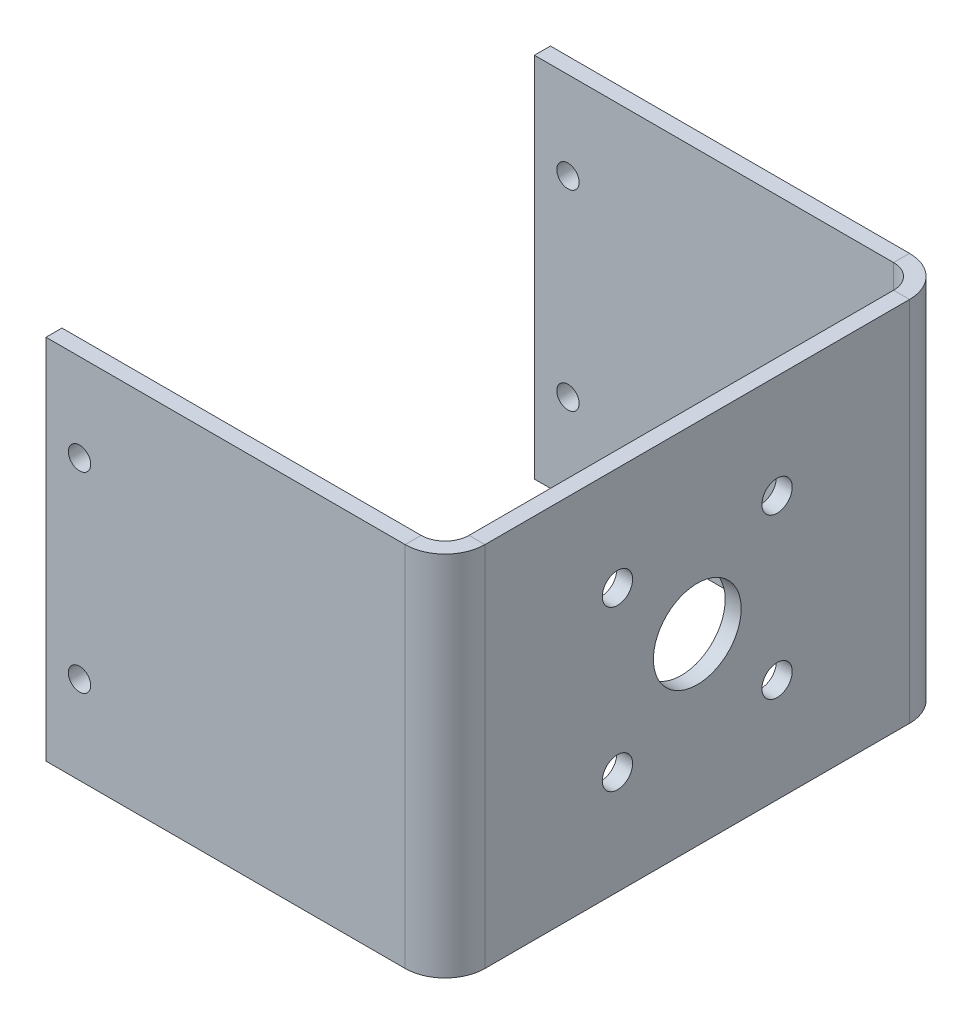
ISO-10303-21;
HEADER;
FILE_DESCRIPTION(('STEP AP214'),'2;1');
FILE_NAME('part.step','',(''),(''),'','','');
FILE_SCHEMA(('AUTOMOTIVE_DESIGN { 1 0 10303 214 1 1 1 1 }'));
ENDSEC;
DATA;
#1=APPLICATION_CONTEXT('core data for automotive mechanical design processes');
#2=APPLICATION_PROTOCOL_DEFINITION('international standard','automotive_design',2000,#1);
#3=PRODUCT_CONTEXT('',#1,'mechanical');
#4=PRODUCT('Part','Part','',(#3));
#5=PRODUCT_RELATED_PRODUCT_CATEGORY('part','',(#4));
#6=PRODUCT_DEFINITION_FORMATION('','',#4);
#7=PRODUCT_DEFINITION_CONTEXT('part definition',#1,'design');
#8=PRODUCT_DEFINITION('design','',#6,#7);
#9=PRODUCT_DEFINITION_SHAPE('','',#8);
#10=(LENGTH_UNIT() NAMED_UNIT(*) SI_UNIT(.MILLI.,.METRE.));
#11=(NAMED_UNIT(*) PLANE_ANGLE_UNIT() SI_UNIT($,.RADIAN.));
#12=(NAMED_UNIT(*) SI_UNIT($,.STERADIAN.) SOLID_ANGLE_UNIT());
#13=UNCERTAINTY_MEASURE_WITH_UNIT(LENGTH_MEASURE(1.E-05),#10,'distance_accuracy_value','');
#14=(GEOMETRIC_REPRESENTATION_CONTEXT(3) GLOBAL_UNCERTAINTY_ASSIGNED_CONTEXT((#13)) GLOBAL_UNIT_ASSIGNED_CONTEXT((#10,
#11,#12)) REPRESENTATION_CONTEXT('',''));
#15=CARTESIAN_POINT('',(0.,0.,0.));
#16=DIRECTION('',(0.,0.,1.));
#17=DIRECTION('',(1.,0.,0.));
#18=AXIS2_PLACEMENT_3D('',#15,#16,#17);
#19=CARTESIAN_POINT('',(-9.99999999999999,0.,0.));
#20=DIRECTION('',(-1.,0.,0.));
#21=DIRECTION('',(0.,0.,1.));
#22=AXIS2_PLACEMENT_3D('',#19,#20,#21);
#23=PLANE('',#22);
#24=CARTESIAN_POINT('',(-9.99999999999999,49.9999999999998,-50.0000000000002));
#25=DIRECTION('',(1.,0.,0.));
#26=DIRECTION('',(0.,-1.,0.));
#27=AXIS2_PLACEMENT_3D('',#24,#25,#26);
#28=CIRCLE('',#27,9.5);
#29=CARTESIAN_POINT('',(-9.99999999999999,40.4999999999998,-50.0000000000001));
#30=VERTEX_POINT('',#29);
#31=EDGE_CURVE('E374',#30,#30,#28,.T.);
#32=ORIENTED_EDGE('',*,*,#31,.T.);
#33=EDGE_LOOP('',(#32));
#34=FACE_BOUND('',#33,.T.);
#35=CARTESIAN_POINT('',(-9.99999999999999,-50.,-50.));
#36=DIRECTION('',(1.,0.,0.));
#37=DIRECTION('',(0.,0.,1.));
#38=AXIS2_PLACEMENT_3D('',#35,#36,#37);
#39=CIRCLE('',#38,9.5);
#40=CARTESIAN_POINT('',(-9.99999999999999,-50.,-40.5));
#41=VERTEX_POINT('',#40);
#42=EDGE_CURVE('E383',#41,#41,#39,.T.);
#43=ORIENTED_EDGE('',*,*,#42,.T.);
#44=EDGE_LOOP('',(#43));
#45=FACE_BOUND('',#44,.T.);
#46=CARTESIAN_POINT('',(-9.99999999999999,-49.9999999999995,50.0000000000005));
#47=DIRECTION('',(1.,0.,0.));
#48=DIRECTION('',(0.,1.,0.));
#49=AXIS2_PLACEMENT_3D('',#46,#47,#48);
#50=CIRCLE('',#49,9.5);
#51=CARTESIAN_POINT('',(-9.99999999999999,-40.4999999999995,50.0000000000004));
#52=VERTEX_POINT('',#51);
#53=EDGE_CURVE('E391',#52,#52,#50,.T.);
#54=ORIENTED_EDGE('',*,*,#53,.T.);
#55=EDGE_LOOP('',(#54));
#56=FACE_BOUND('',#55,.T.);
#57=CARTESIAN_POINT('',(-9.99999999999999,50.,50.));
#58=DIRECTION('',(1.,0.,0.));
#59=DIRECTION('',(0.,0.,-1.));
#60=AXIS2_PLACEMENT_3D('',#57,#58,#59);
#61=CIRCLE('',#60,9.5);
#62=CARTESIAN_POINT('',(-9.99999999999999,50.,40.5));
#63=VERTEX_POINT('',#62);
#64=EDGE_CURVE('E398',#63,#63,#61,.T.);
#65=ORIENTED_EDGE('',*,*,#64,.T.);
#66=EDGE_LOOP('',(#65));
#67=FACE_BOUND('',#66,.T.);
#68=CARTESIAN_POINT('',(-9.99999999999999,0.,0.));
#69=DIRECTION('',(1.,0.,0.));
#70=DIRECTION('',(0.,0.,-1.));
#71=AXIS2_PLACEMENT_3D('',#68,#69,#70);
#72=CIRCLE('',#71,27.5);
#73=CARTESIAN_POINT('',(-9.99999999999999,0.,-27.5));
#74=VERTEX_POINT('',#73);
#75=EDGE_CURVE('E229',#74,#74,#72,.T.);
#76=ORIENTED_EDGE('',*,*,#75,.T.);
#77=EDGE_LOOP('',(#76));
#78=FACE_BOUND('',#77,.T.);
#79=DIRECTION('',(0.,0.,1.));
#80=VECTOR('',#79,1.);
#81=CARTESIAN_POINT('',(-9.99999999999999,115.,158.));
#82=LINE('',#81,#80);
#83=CARTESIAN_POINT('',(-9.99999999999995,115.,-133.));
#84=VERTEX_POINT('',#83);
#85=CARTESIAN_POINT('',(-9.99999999999999,115.,133.));
#86=VERTEX_POINT('',#85);
#87=EDGE_CURVE('E93',#84,#86,#82,.T.);
#88=ORIENTED_EDGE('',*,*,#87,.F.);
#89=DIRECTION('',(0.,-1.,0.));
#90=VECTOR('',#89,1.);
#91=CARTESIAN_POINT('',(-9.99999999999995,-115.,-133.));
#92=LINE('',#91,#90);
#93=CARTESIAN_POINT('',(-9.99999999999995,-115.,-133.));
#94=VERTEX_POINT('',#93);
#95=EDGE_CURVE('E246',#94,#84,#92,.F.);
#96=ORIENTED_EDGE('',*,*,#95,.F.);
#97=DIRECTION('',(0.,0.,-1.));
#98=VECTOR('',#97,1.);
#99=CARTESIAN_POINT('',(-9.99999999999999,-115.,158.));
#100=LINE('',#99,#98);
#101=CARTESIAN_POINT('',(-9.99999999999999,-115.,133.));
#102=VERTEX_POINT('',#101);
#103=EDGE_CURVE('E13',#102,#94,#100,.T.);
#104=ORIENTED_EDGE('',*,*,#103,.F.);
#105=DIRECTION('',(0.,1.,0.));
#106=VECTOR('',#105,1.);
#107=CARTESIAN_POINT('',(-9.99999999999995,115.,133.));
#108=LINE('',#107,#106);
#109=EDGE_CURVE('E320',#86,#102,#108,.F.);
#110=ORIENTED_EDGE('',*,*,#109,.F.);
#111=EDGE_LOOP('',(#88,#96,#104,#110));
#112=FACE_BOUND('',#111,.T.);
#113=ADVANCED_FACE('F83',(#34,#45,#56,#67,#78,#112),#23,.T.);
#114=CARTESIAN_POINT('',(0.,0.,0.));
#115=DIRECTION('',(-1.,0.,0.));
#116=DIRECTION('',(0.,0.,1.));
#117=AXIS2_PLACEMENT_3D('',#114,#115,#116);
#118=PLANE('',#117);
#119=CARTESIAN_POINT('',(0.,49.9999999999998,-50.0000000000002));
#120=DIRECTION('',(1.,0.,0.));
#121=DIRECTION('',(0.,-1.,0.));
#122=AXIS2_PLACEMENT_3D('',#119,#120,#121);
#123=CIRCLE('',#122,9.5);
#124=CARTESIAN_POINT('',(0.,40.4999999999998,-50.0000000000001));
#125=VERTEX_POINT('',#124);
#126=EDGE_CURVE('E379',#125,#125,#123,.T.);
#127=ORIENTED_EDGE('',*,*,#126,.F.);
#128=EDGE_LOOP('',(#127));
#129=FACE_BOUND('',#128,.T.);
#130=CARTESIAN_POINT('',(0.,-50.,-50.));
#131=DIRECTION('',(1.,0.,0.));
#132=DIRECTION('',(0.,0.,1.));
#133=AXIS2_PLACEMENT_3D('',#130,#131,#132);
#134=CIRCLE('',#133,9.5);
#135=CARTESIAN_POINT('',(0.,-50.,-40.5));
#136=VERTEX_POINT('',#135);
#137=EDGE_CURVE('E387',#136,#136,#134,.T.);
#138=ORIENTED_EDGE('',*,*,#137,.F.);
#139=EDGE_LOOP('',(#138));
#140=FACE_BOUND('',#139,.T.);
#141=CARTESIAN_POINT('',(0.,-49.9999999999995,50.0000000000005));
#142=DIRECTION('',(1.,0.,0.));
#143=DIRECTION('',(0.,1.,0.));
#144=AXIS2_PLACEMENT_3D('',#141,#142,#143);
#145=CIRCLE('',#144,9.5);
#146=CARTESIAN_POINT('',(0.,-40.4999999999995,50.0000000000004));
#147=VERTEX_POINT('',#146);
#148=EDGE_CURVE('E373',#147,#147,#145,.T.);
#149=ORIENTED_EDGE('',*,*,#148,.F.);
#150=EDGE_LOOP('',(#149));
#151=FACE_BOUND('',#150,.T.);
#152=CARTESIAN_POINT('',(0.,50.,50.));
#153=DIRECTION('',(1.,0.,0.));
#154=DIRECTION('',(0.,0.,-1.));
#155=AXIS2_PLACEMENT_3D('',#152,#153,#154);
#156=CIRCLE('',#155,9.5);
#157=CARTESIAN_POINT('',(0.,50.,40.5));
#158=VERTEX_POINT('',#157);
#159=EDGE_CURVE('E378',#158,#158,#156,.T.);
#160=ORIENTED_EDGE('',*,*,#159,.F.);
#161=EDGE_LOOP('',(#160));
#162=FACE_BOUND('',#161,.T.);
#163=CARTESIAN_POINT('',(0.,0.,0.));
#164=DIRECTION('',(1.,0.,0.));
#165=DIRECTION('',(0.,0.,-1.));
#166=AXIS2_PLACEMENT_3D('',#163,#164,#165);
#167=CIRCLE('',#166,27.5);
#168=CARTESIAN_POINT('',(0.,0.,-27.5));
#169=VERTEX_POINT('',#168);
#170=EDGE_CURVE('E402',#169,#169,#167,.T.);
#171=ORIENTED_EDGE('',*,*,#170,.F.);
#172=EDGE_LOOP('',(#171));
#173=FACE_BOUND('',#172,.T.);
#174=DIRECTION('',(0.,-1.,0.));
#175=VECTOR('',#174,1.);
#176=CARTESIAN_POINT('',(0.,-115.,-133.));
#177=LINE('',#176,#175);
#178=CARTESIAN_POINT('',(0.,-115.,-133.));
#179=VERTEX_POINT('',#178);
#180=CARTESIAN_POINT('',(0.,115.,-133.));
#181=VERTEX_POINT('',#180);
#182=EDGE_CURVE('E230',#179,#181,#177,.F.);
#183=ORIENTED_EDGE('',*,*,#182,.T.);
#184=DIRECTION('',(0.,0.,1.));
#185=VECTOR('',#184,1.);
#186=CARTESIAN_POINT('',(0.,115.,158.));
#187=LINE('',#186,#185);
#188=CARTESIAN_POINT('',(0.,115.,133.));
#189=VERTEX_POINT('',#188);
#190=EDGE_CURVE('E329',#181,#189,#187,.T.);
#191=ORIENTED_EDGE('',*,*,#190,.T.);
#192=DIRECTION('',(0.,1.,0.));
#193=VECTOR('',#192,1.);
#194=CARTESIAN_POINT('',(0.,115.,133.));
#195=LINE('',#194,#193);
#196=CARTESIAN_POINT('',(0.,-115.,133.));
#197=VERTEX_POINT('',#196);
#198=EDGE_CURVE('E304',#189,#197,#195,.F.);
#199=ORIENTED_EDGE('',*,*,#198,.T.);
#200=DIRECTION('',(0.,0.,-1.));
#201=VECTOR('',#200,1.);
#202=CARTESIAN_POINT('',(0.,-115.,158.));
#203=LINE('',#202,#201);
#204=EDGE_CURVE('E333',#197,#179,#203,.T.);
#205=ORIENTED_EDGE('',*,*,#204,.T.);
#206=EDGE_LOOP('',(#183,#191,#199,#205));
#207=FACE_BOUND('',#206,.T.);
#208=ADVANCED_FACE('F434',(#129,#140,#151,#162,#173,#207),#118,.F.);
#209=CARTESIAN_POINT('',(-9.99999999999999,-115.,158.));
#210=DIRECTION('',(0.,-1.,0.));
#211=DIRECTION('',(0.,0.,-1.));
#212=AXIS2_PLACEMENT_3D('',#209,#210,#211);
#213=PLANE('',#212);
#214=ORIENTED_EDGE('',*,*,#103,.T.);
#215=DIRECTION('',(1.,0.,0.));
#216=VECTOR('',#215,1.);
#217=CARTESIAN_POINT('',(-9.99999999999995,-115.,-133.));
#218=LINE('',#217,#216);
#219=EDGE_CURVE('E238',#94,#179,#218,.T.);
#220=ORIENTED_EDGE('',*,*,#219,.T.);
#221=ORIENTED_EDGE('',*,*,#204,.F.);
#222=DIRECTION('',(1.,0.,0.));
#223=VECTOR('',#222,1.);
#224=CARTESIAN_POINT('',(-9.99999999999995,-115.,133.));
#225=LINE('',#224,#223);
#226=EDGE_CURVE('E107',#102,#197,#225,.T.);
#227=ORIENTED_EDGE('',*,*,#226,.F.);
#228=EDGE_LOOP('',(#214,#220,#221,#227));
#229=FACE_BOUND('',#228,.T.);
#230=ADVANCED_FACE('F428',(#229),#213,.T.);
#231=CARTESIAN_POINT('',(-9.99999999999999,115.,158.));
#232=DIRECTION('',(0.,1.,0.));
#233=DIRECTION('',(0.,0.,1.));
#234=AXIS2_PLACEMENT_3D('',#231,#232,#233);
#235=PLANE('',#234);
#236=DIRECTION('',(1.,0.,0.));
#237=VECTOR('',#236,1.);
#238=CARTESIAN_POINT('',(-9.99999999999995,115.,-133.));
#239=LINE('',#238,#237);
#240=EDGE_CURVE('E254',#84,#181,#239,.T.);
#241=ORIENTED_EDGE('',*,*,#240,.F.);
#242=ORIENTED_EDGE('',*,*,#87,.T.);
#243=DIRECTION('',(1.,0.,0.));
#244=VECTOR('',#243,1.);
#245=CARTESIAN_POINT('',(-9.99999999999995,115.,133.));
#246=LINE('',#245,#244);
#247=EDGE_CURVE('E312',#86,#189,#246,.T.);
#248=ORIENTED_EDGE('',*,*,#247,.T.);
#249=ORIENTED_EDGE('',*,*,#190,.F.);
#250=EDGE_LOOP('',(#241,#242,#248,#249));
#251=FACE_BOUND('',#250,.T.);
#252=ADVANCED_FACE('F85',(#251),#235,.T.);
#253=CARTESIAN_POINT('',(-25.,-115.,133.));
#254=DIRECTION('',(0.,-1.,0.));
#255=DIRECTION('',(0.,0.,-1.));
#256=AXIS2_PLACEMENT_3D('',#253,#254,#255);
#257=PLANE('',#256);
#258=DIRECTION('',(0.,0.,-1.));
#259=VECTOR('',#258,1.);
#260=CARTESIAN_POINT('',(-25.,-115.,158.));
#261=LINE('',#260,#259);
#262=CARTESIAN_POINT('',(-24.9999999999999,-115.,148.));
#263=VERTEX_POINT('',#262);
#264=CARTESIAN_POINT('',(-24.9999999999999,-115.,158.));
#265=VERTEX_POINT('',#264);
#266=EDGE_CURVE('E258',#263,#265,#261,.F.);
#267=ORIENTED_EDGE('',*,*,#266,.F.);
#268=CARTESIAN_POINT('',(-25.,-115.,133.));
#269=DIRECTION('',(0.,1.,0.));
#270=DIRECTION('',(0.,0.,1.));
#271=AXIS2_PLACEMENT_3D('',#268,#269,#270);
#272=CIRCLE('',#271,15.);
#273=EDGE_CURVE('E316',#102,#263,#272,.F.);
#274=ORIENTED_EDGE('',*,*,#273,.F.);
#275=ORIENTED_EDGE('',*,*,#226,.T.);
#276=CARTESIAN_POINT('',(-25.,-115.,133.));
#277=DIRECTION('',(0.,1.,0.));
#278=DIRECTION('',(0.,0.,1.));
#279=AXIS2_PLACEMENT_3D('',#276,#277,#278);
#280=CIRCLE('',#279,25.);
#281=EDGE_CURVE('E307',#197,#265,#280,.F.);
#282=ORIENTED_EDGE('',*,*,#281,.T.);
#283=EDGE_LOOP('',(#267,#274,#275,#282));
#284=FACE_BOUND('',#283,.T.);
#285=ADVANCED_FACE('F467',(#284),#257,.T.);
#286=CARTESIAN_POINT('',(-25.,115.,133.));
#287=DIRECTION('',(0.,-1.,0.));
#288=DIRECTION('',(0.,0.,-1.));
#289=AXIS2_PLACEMENT_3D('',#286,#287,#288);
#290=PLANE('',#289);
#291=CARTESIAN_POINT('',(-25.,115.,133.));
#292=DIRECTION('',(0.,1.,0.));
#293=DIRECTION('',(0.,0.,1.));
#294=AXIS2_PLACEMENT_3D('',#291,#292,#293);
#295=CIRCLE('',#294,15.);
#296=CARTESIAN_POINT('',(-24.9999999999999,115.,148.));
#297=VERTEX_POINT('',#296);
#298=EDGE_CURVE('E266',#297,#86,#295,.T.);
#299=ORIENTED_EDGE('',*,*,#298,.F.);
#300=DIRECTION('',(0.,0.,-1.));
#301=VECTOR('',#300,1.);
#302=CARTESIAN_POINT('',(-25.,115.,148.));
#303=LINE('',#302,#301);
#304=CARTESIAN_POINT('',(-25.,115.,158.));
#305=VERTEX_POINT('',#304);
#306=EDGE_CURVE('E294',#297,#305,#303,.F.);
#307=ORIENTED_EDGE('',*,*,#306,.T.);
#308=CARTESIAN_POINT('',(-25.,115.,133.));
#309=DIRECTION('',(0.,1.,0.));
#310=DIRECTION('',(0.,0.,1.));
#311=AXIS2_PLACEMENT_3D('',#308,#309,#310);
#312=CIRCLE('',#311,25.);
#313=EDGE_CURVE('E308',#305,#189,#312,.T.);
#314=ORIENTED_EDGE('',*,*,#313,.T.);
#315=ORIENTED_EDGE('',*,*,#247,.F.);
#316=EDGE_LOOP('',(#299,#307,#314,#315));
#317=FACE_BOUND('',#316,.T.);
#318=ADVANCED_FACE('F461',(#317),#290,.F.);
#319=CARTESIAN_POINT('',(-25.,115.,133.));
#320=DIRECTION('',(0.,1.,0.));
#321=DIRECTION('',(0.,0.,1.));
#322=AXIS2_PLACEMENT_3D('',#319,#320,#321);
#323=CYLINDRICAL_SURFACE('',#322,25.);
#324=ORIENTED_EDGE('',*,*,#198,.F.);
#325=ORIENTED_EDGE('',*,*,#313,.F.);
#326=DIRECTION('',(0.,1.,0.));
#327=VECTOR('',#326,1.);
#328=CARTESIAN_POINT('',(-25.,-115.,158.));
#329=LINE('',#328,#327);
#330=EDGE_CURVE('E291',#305,#265,#329,.F.);
#331=ORIENTED_EDGE('',*,*,#330,.T.);
#332=ORIENTED_EDGE('',*,*,#281,.F.);
#333=EDGE_LOOP('',(#324,#325,#331,#332));
#334=FACE_BOUND('',#333,.T.);
#335=ADVANCED_FACE('F475',(#334),#323,.T.);
#336=CARTESIAN_POINT('',(-25.,115.,133.));
#337=DIRECTION('',(0.,1.,0.));
#338=DIRECTION('',(0.,0.,1.));
#339=AXIS2_PLACEMENT_3D('',#336,#337,#338);
#340=CYLINDRICAL_SURFACE('',#339,15.);
#341=ORIENTED_EDGE('',*,*,#109,.T.);
#342=ORIENTED_EDGE('',*,*,#273,.T.);
#343=DIRECTION('',(0.,1.,0.));
#344=VECTOR('',#343,1.);
#345=CARTESIAN_POINT('',(-25.,-115.,148.));
#346=LINE('',#345,#344);
#347=EDGE_CURVE('E298',#263,#297,#346,.T.);
#348=ORIENTED_EDGE('',*,*,#347,.T.);
#349=ORIENTED_EDGE('',*,*,#298,.T.);
#350=EDGE_LOOP('',(#341,#342,#348,#349));
#351=FACE_BOUND('',#350,.T.);
#352=ADVANCED_FACE('F478',(#351),#340,.F.);
#353=CARTESIAN_POINT('',(-250.,115.,158.000000000001));
#354=DIRECTION('',(0.,-1.,0.));
#355=DIRECTION('',(1.,0.,0.));
#356=AXIS2_PLACEMENT_3D('',#353,#354,#355);
#357=PLANE('',#356);
#358=ORIENTED_EDGE('',*,*,#306,.F.);
#359=DIRECTION('',(1.,0.,0.));
#360=VECTOR('',#359,1.);
#361=CARTESIAN_POINT('',(-250.,115.,148.000000000001));
#362=LINE('',#361,#360);
#363=CARTESIAN_POINT('',(-250.,115.,148.000000000001));
#364=VERTEX_POINT('',#363);
#365=EDGE_CURVE('E288',#297,#364,#362,.F.);
#366=ORIENTED_EDGE('',*,*,#365,.T.);
#367=DIRECTION('',(0.,0.,-1.));
#368=VECTOR('',#367,1.);
#369=CARTESIAN_POINT('',(-250.,115.,158.000000000001));
#370=LINE('',#369,#368);
#371=CARTESIAN_POINT('',(-250.,115.,158.000000000001));
#372=VERTEX_POINT('',#371);
#373=EDGE_CURVE('E262',#372,#364,#370,.T.);
#374=ORIENTED_EDGE('',*,*,#373,.F.);
#375=DIRECTION('',(-1.,0.,0.));
#376=VECTOR('',#375,1.);
#377=CARTESIAN_POINT('',(5.82867087928207E-13,115.,158.));
#378=LINE('',#377,#376);
#379=EDGE_CURVE('E278',#305,#372,#378,.T.);
#380=ORIENTED_EDGE('',*,*,#379,.F.);
#381=EDGE_LOOP('',(#358,#366,#374,#380));
#382=FACE_BOUND('',#381,.T.);
#383=ADVANCED_FACE('F481',(#382),#357,.F.);
#384=CARTESIAN_POINT('',(-9.99999999999997,-115.,158.));
#385=DIRECTION('',(0.,1.,0.));
#386=DIRECTION('',(0.,0.,1.));
#387=AXIS2_PLACEMENT_3D('',#384,#385,#386);
#388=PLANE('',#387);
#389=ORIENTED_EDGE('',*,*,#266,.T.);
#390=DIRECTION('',(1.,0.,0.));
#391=VECTOR('',#390,1.);
#392=CARTESIAN_POINT('',(5.82867087928207E-13,-115.,158.));
#393=LINE('',#392,#391);
#394=CARTESIAN_POINT('',(-250.,-115.,158.000000000001));
#395=VERTEX_POINT('',#394);
#396=EDGE_CURVE('E271',#395,#265,#393,.T.);
#397=ORIENTED_EDGE('',*,*,#396,.F.);
#398=DIRECTION('',(0.,0.,-1.));
#399=VECTOR('',#398,1.);
#400=CARTESIAN_POINT('',(-250.,-115.,158.000000000001));
#401=LINE('',#400,#399);
#402=CARTESIAN_POINT('',(-250.,-115.,148.000000000001));
#403=VERTEX_POINT('',#402);
#404=EDGE_CURVE('E267',#395,#403,#401,.T.);
#405=ORIENTED_EDGE('',*,*,#404,.T.);
#406=DIRECTION('',(-1.,0.,0.));
#407=VECTOR('',#406,1.);
#408=CARTESIAN_POINT('',(-9.99999999999999,-115.,148.));
#409=LINE('',#408,#407);
#410=EDGE_CURVE('E281',#403,#263,#409,.F.);
#411=ORIENTED_EDGE('',*,*,#410,.T.);
#412=EDGE_LOOP('',(#389,#397,#405,#411));
#413=FACE_BOUND('',#412,.T.);
#414=ADVANCED_FACE('F487',(#413),#388,.F.);
#415=CARTESIAN_POINT('',(5.82867087928207E-13,0.,158.));
#416=DIRECTION('',(0.,0.,-1.));
#417=DIRECTION('',(-1.,0.,0.));
#418=AXIS2_PLACEMENT_3D('',#415,#416,#417);
#419=PLANE('',#418);
#420=CARTESIAN_POINT('',(-228.999999999998,60.,158.));
#421=DIRECTION('',(0.,0.,1.));
#422=DIRECTION('',(1.,0.,0.));
#423=AXIS2_PLACEMENT_3D('',#420,#421,#422);
#424=CIRCLE('',#423,6.99999999999998);
#425=CARTESIAN_POINT('',(-221.999999999998,60.,158.));
#426=VERTEX_POINT('',#425);
#427=EDGE_CURVE('E352',#426,#426,#424,.T.);
#428=ORIENTED_EDGE('',*,*,#427,.F.);
#429=EDGE_LOOP('',(#428));
#430=FACE_BOUND('',#429,.T.);
#431=CARTESIAN_POINT('',(-228.999999999998,-60.,158.));
#432=DIRECTION('',(0.,0.,1.));
#433=DIRECTION('',(1.,0.,0.));
#434=AXIS2_PLACEMENT_3D('',#431,#432,#433);
#435=CIRCLE('',#434,6.99999999999998);
#436=CARTESIAN_POINT('',(-221.999999999998,-60.,158.));
#437=VERTEX_POINT('',#436);
#438=EDGE_CURVE('E365',#437,#437,#435,.T.);
#439=ORIENTED_EDGE('',*,*,#438,.F.);
#440=EDGE_LOOP('',(#439));
#441=FACE_BOUND('',#440,.T.);
#442=ORIENTED_EDGE('',*,*,#330,.F.);
#443=ORIENTED_EDGE('',*,*,#379,.T.);
#444=DIRECTION('',(0.,-1.,0.));
#445=VECTOR('',#444,1.);
#446=CARTESIAN_POINT('',(-250.,0.,158.000000000001));
#447=LINE('',#446,#445);
#448=EDGE_CURVE('E275',#372,#395,#447,.T.);
#449=ORIENTED_EDGE('',*,*,#448,.T.);
#450=ORIENTED_EDGE('',*,*,#396,.T.);
#451=EDGE_LOOP('',(#442,#443,#449,#450));
#452=FACE_BOUND('',#451,.T.);
#453=ADVANCED_FACE('F492',(#430,#441,#452),#419,.F.);
#454=CARTESIAN_POINT('',(5.41233724504764E-13,0.,148.));
#455=DIRECTION('',(0.,0.,-1.));
#456=DIRECTION('',(-1.,0.,0.));
#457=AXIS2_PLACEMENT_3D('',#454,#455,#456);
#458=PLANE('',#457);
#459=CARTESIAN_POINT('',(-228.999999999998,60.,148.000000000001));
#460=DIRECTION('',(0.,0.,-1.));
#461=DIRECTION('',(-1.,0.,0.));
#462=AXIS2_PLACEMENT_3D('',#459,#460,#461);
#463=CIRCLE('',#462,6.99999999999998);
#464=CARTESIAN_POINT('',(-235.999999999998,60.,148.000000000001));
#465=VERTEX_POINT('',#464);
#466=EDGE_CURVE('E369',#465,#465,#463,.T.);
#467=ORIENTED_EDGE('',*,*,#466,.F.);
#468=EDGE_LOOP('',(#467));
#469=FACE_BOUND('',#468,.T.);
#470=CARTESIAN_POINT('',(-228.999999999998,-60.,148.000000000001));
#471=DIRECTION('',(0.,0.,-1.));
#472=DIRECTION('',(-1.,0.,0.));
#473=AXIS2_PLACEMENT_3D('',#470,#471,#472);
#474=CIRCLE('',#473,6.99999999999998);
#475=CARTESIAN_POINT('',(-235.999999999998,-60.,148.000000000001));
#476=VERTEX_POINT('',#475);
#477=EDGE_CURVE('E342',#476,#476,#474,.T.);
#478=ORIENTED_EDGE('',*,*,#477,.F.);
#479=EDGE_LOOP('',(#478));
#480=FACE_BOUND('',#479,.T.);
#481=ORIENTED_EDGE('',*,*,#365,.F.);
#482=ORIENTED_EDGE('',*,*,#347,.F.);
#483=ORIENTED_EDGE('',*,*,#410,.F.);
#484=DIRECTION('',(0.,1.,0.));
#485=VECTOR('',#484,1.);
#486=CARTESIAN_POINT('',(-250.,-115.,148.000000000001));
#487=LINE('',#486,#485);
#488=EDGE_CURVE('E285',#364,#403,#487,.F.);
#489=ORIENTED_EDGE('',*,*,#488,.F.);
#490=EDGE_LOOP('',(#481,#482,#483,#489));
#491=FACE_BOUND('',#490,.T.);
#492=ADVANCED_FACE('F447',(#469,#480,#491),#458,.T.);
#493=CARTESIAN_POINT('',(-250.,-115.,158.000000000001));
#494=DIRECTION('',(1.,0.,0.));
#495=DIRECTION('',(0.,0.,-1.));
#496=AXIS2_PLACEMENT_3D('',#493,#494,#495);
#497=PLANE('',#496);
#498=ORIENTED_EDGE('',*,*,#488,.T.);
#499=ORIENTED_EDGE('',*,*,#404,.F.);
#500=ORIENTED_EDGE('',*,*,#448,.F.);
#501=ORIENTED_EDGE('',*,*,#373,.T.);
#502=EDGE_LOOP('',(#498,#499,#500,#501));
#503=FACE_BOUND('',#502,.T.);
#504=ADVANCED_FACE('F440',(#503),#497,.F.);
#505=CARTESIAN_POINT('',(-25.,115.,-133.));
#506=DIRECTION('',(0.,1.,0.));
#507=DIRECTION('',(0.,0.,1.));
#508=AXIS2_PLACEMENT_3D('',#505,#506,#507);
#509=PLANE('',#508);
#510=DIRECTION('',(0.,0.,1.));
#511=VECTOR('',#510,1.);
#512=CARTESIAN_POINT('',(-25.,115.,-158.));
#513=LINE('',#512,#511);
#514=CARTESIAN_POINT('',(-24.9999999999999,115.,-148.));
#515=VERTEX_POINT('',#514);
#516=CARTESIAN_POINT('',(-24.9999999999999,115.,-158.));
#517=VERTEX_POINT('',#516);
#518=EDGE_CURVE('E201',#515,#517,#513,.F.);
#519=ORIENTED_EDGE('',*,*,#518,.F.);
#520=CARTESIAN_POINT('',(-25.,115.,-133.));
#521=DIRECTION('',(0.,-1.,0.));
#522=DIRECTION('',(0.,0.,-1.));
#523=AXIS2_PLACEMENT_3D('',#520,#521,#522);
#524=CIRCLE('',#523,15.);
#525=EDGE_CURVE('E242',#84,#515,#524,.F.);
#526=ORIENTED_EDGE('',*,*,#525,.F.);
#527=ORIENTED_EDGE('',*,*,#240,.T.);
#528=CARTESIAN_POINT('',(-25.,115.,-133.));
#529=DIRECTION('',(0.,-1.,0.));
#530=DIRECTION('',(0.,0.,-1.));
#531=AXIS2_PLACEMENT_3D('',#528,#529,#530);
#532=CIRCLE('',#531,25.);
#533=EDGE_CURVE('E233',#181,#517,#532,.F.);
#534=ORIENTED_EDGE('',*,*,#533,.T.);
#535=EDGE_LOOP('',(#519,#526,#527,#534));
#536=FACE_BOUND('',#535,.T.);
#537=ADVANCED_FACE('F438',(#536),#509,.T.);
#538=CARTESIAN_POINT('',(-25.,-115.,-133.));
#539=DIRECTION('',(0.,1.,0.));
#540=DIRECTION('',(0.,0.,1.));
#541=AXIS2_PLACEMENT_3D('',#538,#539,#540);
#542=PLANE('',#541);
#543=CARTESIAN_POINT('',(-25.,-115.,-133.));
#544=DIRECTION('',(0.,-1.,0.));
#545=DIRECTION('',(0.,0.,-1.));
#546=AXIS2_PLACEMENT_3D('',#543,#544,#545);
#547=CIRCLE('',#546,15.);
#548=CARTESIAN_POINT('',(-24.9999999999999,-115.,-148.));
#549=VERTEX_POINT('',#548);
#550=EDGE_CURVE('E250',#549,#94,#547,.T.);
#551=ORIENTED_EDGE('',*,*,#550,.F.);
#552=DIRECTION('',(0.,0.,1.));
#553=VECTOR('',#552,1.);
#554=CARTESIAN_POINT('',(-25.,-115.,-148.));
#555=LINE('',#554,#553);
#556=CARTESIAN_POINT('',(-25.,-115.,-158.));
#557=VERTEX_POINT('',#556);
#558=EDGE_CURVE('E220',#549,#557,#555,.F.);
#559=ORIENTED_EDGE('',*,*,#558,.T.);
#560=CARTESIAN_POINT('',(-25.,-115.,-133.));
#561=DIRECTION('',(0.,-1.,0.));
#562=DIRECTION('',(0.,0.,-1.));
#563=AXIS2_PLACEMENT_3D('',#560,#561,#562);
#564=CIRCLE('',#563,25.);
#565=EDGE_CURVE('E234',#557,#179,#564,.T.);
#566=ORIENTED_EDGE('',*,*,#565,.T.);
#567=ORIENTED_EDGE('',*,*,#219,.F.);
#568=EDGE_LOOP('',(#551,#559,#566,#567));
#569=FACE_BOUND('',#568,.T.);
#570=ADVANCED_FACE('F426',(#569),#542,.F.);
#571=CARTESIAN_POINT('',(-25.,-115.,-133.));
#572=DIRECTION('',(0.,-1.,0.));
#573=DIRECTION('',(0.,0.,-1.));
#574=AXIS2_PLACEMENT_3D('',#571,#572,#573);
#575=CYLINDRICAL_SURFACE('',#574,25.);
#576=ORIENTED_EDGE('',*,*,#182,.F.);
#577=ORIENTED_EDGE('',*,*,#565,.F.);
#578=DIRECTION('',(0.,-1.,0.));
#579=VECTOR('',#578,1.);
#580=CARTESIAN_POINT('',(-25.,115.,-158.));
#581=LINE('',#580,#579);
#582=EDGE_CURVE('E217',#557,#517,#581,.F.);
#583=ORIENTED_EDGE('',*,*,#582,.T.);
#584=ORIENTED_EDGE('',*,*,#533,.F.);
#585=EDGE_LOOP('',(#576,#577,#583,#584));
#586=FACE_BOUND('',#585,.T.);
#587=ADVANCED_FACE('F431',(#586),#575,.T.);
#588=CARTESIAN_POINT('',(-25.,-115.,-133.));
#589=DIRECTION('',(0.,-1.,0.));
#590=DIRECTION('',(0.,0.,-1.));
#591=AXIS2_PLACEMENT_3D('',#588,#589,#590);
#592=CYLINDRICAL_SURFACE('',#591,15.);
#593=ORIENTED_EDGE('',*,*,#95,.T.);
#594=ORIENTED_EDGE('',*,*,#525,.T.);
#595=DIRECTION('',(0.,-1.,0.));
#596=VECTOR('',#595,1.);
#597=CARTESIAN_POINT('',(-25.,115.,-148.));
#598=LINE('',#597,#596);
#599=EDGE_CURVE('E224',#515,#549,#598,.T.);
#600=ORIENTED_EDGE('',*,*,#599,.T.);
#601=ORIENTED_EDGE('',*,*,#550,.T.);
#602=EDGE_LOOP('',(#593,#594,#600,#601));
#603=FACE_BOUND('',#602,.T.);
#604=ADVANCED_FACE('F422',(#603),#592,.F.);
#605=CARTESIAN_POINT('',(-250.,-115.,-158.000000000001));
#606=DIRECTION('',(0.,1.,0.));
#607=DIRECTION('',(-1.,0.,0.));
#608=AXIS2_PLACEMENT_3D('',#605,#606,#607);
#609=PLANE('',#608);
#610=ORIENTED_EDGE('',*,*,#558,.F.);
#611=DIRECTION('',(1.,0.,0.));
#612=VECTOR('',#611,1.);
#613=CARTESIAN_POINT('',(-250.,-115.,-148.000000000001));
#614=LINE('',#613,#612);
#615=CARTESIAN_POINT('',(-250.,-115.,-148.000000000001));
#616=VERTEX_POINT('',#615);
#617=EDGE_CURVE('E214',#549,#616,#614,.F.);
#618=ORIENTED_EDGE('',*,*,#617,.T.);
#619=DIRECTION('',(0.,0.,1.));
#620=VECTOR('',#619,1.);
#621=CARTESIAN_POINT('',(-250.,-115.,-158.000000000001));
#622=LINE('',#621,#620);
#623=CARTESIAN_POINT('',(-250.,-115.,-158.000000000001));
#624=VERTEX_POINT('',#623);
#625=EDGE_CURVE('E197',#624,#616,#622,.T.);
#626=ORIENTED_EDGE('',*,*,#625,.F.);
#627=DIRECTION('',(-1.,0.,0.));
#628=VECTOR('',#627,1.);
#629=CARTESIAN_POINT('',(5.82867087928207E-13,-115.,-158.));
#630=LINE('',#629,#628);
#631=EDGE_CURVE('E182',#557,#624,#630,.T.);
#632=ORIENTED_EDGE('',*,*,#631,.F.);
#633=EDGE_LOOP('',(#610,#618,#626,#632));
#634=FACE_BOUND('',#633,.T.);
#635=ADVANCED_FACE('F415',(#634),#609,.F.);
#636=CARTESIAN_POINT('',(-9.99999999999997,115.,-158.));
#637=DIRECTION('',(0.,-1.,0.));
#638=DIRECTION('',(0.,0.,-1.));
#639=AXIS2_PLACEMENT_3D('',#636,#637,#638);
#640=PLANE('',#639);
#641=ORIENTED_EDGE('',*,*,#518,.T.);
#642=DIRECTION('',(1.,0.,0.));
#643=VECTOR('',#642,1.);
#644=CARTESIAN_POINT('',(5.82867087928207E-13,115.,-158.));
#645=LINE('',#644,#643);
#646=CARTESIAN_POINT('',(-250.,115.,-158.000000000001));
#647=VERTEX_POINT('',#646);
#648=EDGE_CURVE('E180',#647,#517,#645,.T.);
#649=ORIENTED_EDGE('',*,*,#648,.F.);
#650=DIRECTION('',(0.,0.,1.));
#651=VECTOR('',#650,1.);
#652=CARTESIAN_POINT('',(-250.,115.,-158.000000000001));
#653=LINE('',#652,#651);
#654=CARTESIAN_POINT('',(-250.,115.,-148.000000000001));
#655=VERTEX_POINT('',#654);
#656=EDGE_CURVE('E189',#647,#655,#653,.T.);
#657=ORIENTED_EDGE('',*,*,#656,.T.);
#658=DIRECTION('',(-1.,0.,0.));
#659=VECTOR('',#658,1.);
#660=CARTESIAN_POINT('',(-9.99999999999999,115.,-148.));
#661=LINE('',#660,#659);
#662=EDGE_CURVE('E209',#655,#515,#661,.F.);
#663=ORIENTED_EDGE('',*,*,#662,.T.);
#664=EDGE_LOOP('',(#641,#649,#657,#663));
#665=FACE_BOUND('',#664,.T.);
#666=ADVANCED_FACE('F200',(#665),#640,.F.);
#667=CARTESIAN_POINT('',(5.82867087928207E-13,0.,-158.));
#668=DIRECTION('',(0.,0.,1.));
#669=DIRECTION('',(1.,0.,0.));
#670=AXIS2_PLACEMENT_3D('',#667,#668,#669);
#671=PLANE('',#670);
#672=CARTESIAN_POINT('',(-228.999999999998,60.,-158.000000000001));
#673=DIRECTION('',(0.,0.,1.));
#674=DIRECTION('',(1.,0.,0.));
#675=AXIS2_PLACEMENT_3D('',#672,#673,#674);
#676=CIRCLE('',#675,6.99999999999998);
#677=CARTESIAN_POINT('',(-221.999999999998,60.,-158.000000000001));
#678=VERTEX_POINT('',#677);
#679=EDGE_CURVE('E343',#678,#678,#676,.T.);
#680=ORIENTED_EDGE('',*,*,#679,.T.);
#681=EDGE_LOOP('',(#680));
#682=FACE_BOUND('',#681,.T.);
#683=CARTESIAN_POINT('',(-228.999999999998,-60.,-158.000000000001));
#684=DIRECTION('',(0.,0.,1.));
#685=DIRECTION('',(1.,0.,0.));
#686=AXIS2_PLACEMENT_3D('',#683,#684,#685);
#687=CIRCLE('',#686,6.99999999999998);
#688=CARTESIAN_POINT('',(-221.999999999998,-60.,-158.000000000001));
#689=VERTEX_POINT('',#688);
#690=EDGE_CURVE('E359',#689,#689,#687,.T.);
#691=ORIENTED_EDGE('',*,*,#690,.T.);
#692=EDGE_LOOP('',(#691));
#693=FACE_BOUND('',#692,.T.);
#694=ORIENTED_EDGE('',*,*,#582,.F.);
#695=ORIENTED_EDGE('',*,*,#631,.T.);
#696=DIRECTION('',(0.,1.,0.));
#697=VECTOR('',#696,1.);
#698=CARTESIAN_POINT('',(-250.,0.,-158.000000000001));
#699=LINE('',#698,#697);
#700=EDGE_CURVE('E175',#624,#647,#699,.T.);
#701=ORIENTED_EDGE('',*,*,#700,.T.);
#702=ORIENTED_EDGE('',*,*,#648,.T.);
#703=EDGE_LOOP('',(#694,#695,#701,#702));
#704=FACE_BOUND('',#703,.T.);
#705=ADVANCED_FACE('F178',(#682,#693,#704),#671,.F.);
#706=CARTESIAN_POINT('',(5.41233724504764E-13,0.,-148.));
#707=DIRECTION('',(0.,0.,1.));
#708=DIRECTION('',(1.,0.,0.));
#709=AXIS2_PLACEMENT_3D('',#706,#707,#708);
#710=PLANE('',#709);
#711=CARTESIAN_POINT('',(-228.999999999998,60.,-148.000000000001));
#712=DIRECTION('',(0.,0.,1.));
#713=DIRECTION('',(1.,0.,0.));
#714=AXIS2_PLACEMENT_3D('',#711,#712,#713);
#715=CIRCLE('',#714,6.99999999999998);
#716=CARTESIAN_POINT('',(-221.999999999998,60.,-148.000000000001));
#717=VERTEX_POINT('',#716);
#718=EDGE_CURVE('E87',#717,#717,#715,.T.);
#719=ORIENTED_EDGE('',*,*,#718,.F.);
#720=EDGE_LOOP('',(#719));
#721=FACE_BOUND('',#720,.T.);
#722=CARTESIAN_POINT('',(-228.999999999998,-60.,-148.000000000001));
#723=DIRECTION('',(0.,0.,1.));
#724=DIRECTION('',(1.,0.,0.));
#725=AXIS2_PLACEMENT_3D('',#722,#723,#724);
#726=CIRCLE('',#725,6.99999999999998);
#727=CARTESIAN_POINT('',(-221.999999999998,-60.,-148.000000000001));
#728=VERTEX_POINT('',#727);
#729=EDGE_CURVE('E339',#728,#728,#726,.T.);
#730=ORIENTED_EDGE('',*,*,#729,.F.);
#731=EDGE_LOOP('',(#730));
#732=FACE_BOUND('',#731,.T.);
#733=ORIENTED_EDGE('',*,*,#617,.F.);
#734=ORIENTED_EDGE('',*,*,#599,.F.);
#735=ORIENTED_EDGE('',*,*,#662,.F.);
#736=DIRECTION('',(0.,-1.,0.));
#737=VECTOR('',#736,1.);
#738=CARTESIAN_POINT('',(-250.,115.,-148.000000000001));
#739=LINE('',#738,#737);
#740=EDGE_CURVE('E192',#616,#655,#739,.F.);
#741=ORIENTED_EDGE('',*,*,#740,.F.);
#742=EDGE_LOOP('',(#733,#734,#735,#741));
#743=FACE_BOUND('',#742,.T.);
#744=ADVANCED_FACE('F419',(#721,#732,#743),#710,.T.);
#745=CARTESIAN_POINT('',(-250.,115.,-158.000000000001));
#746=DIRECTION('',(1.,0.,0.));
#747=DIRECTION('',(0.,0.,-1.));
#748=AXIS2_PLACEMENT_3D('',#745,#746,#747);
#749=PLANE('',#748);
#750=ORIENTED_EDGE('',*,*,#740,.T.);
#751=ORIENTED_EDGE('',*,*,#656,.F.);
#752=ORIENTED_EDGE('',*,*,#700,.F.);
#753=ORIENTED_EDGE('',*,*,#625,.T.);
#754=EDGE_LOOP('',(#750,#751,#752,#753));
#755=FACE_BOUND('',#754,.T.);
#756=ADVANCED_FACE('F190',(#755),#749,.F.);
#757=CARTESIAN_POINT('',(-9.99999999999999,0.,0.));
#758=DIRECTION('',(1.,0.,0.));
#759=DIRECTION('',(0.,0.,-1.));
#760=AXIS2_PLACEMENT_3D('',#757,#758,#759);
#761=CYLINDRICAL_SURFACE('',#760,27.5);
#762=ORIENTED_EDGE('',*,*,#75,.F.);
#763=EDGE_LOOP('',(#762));
#764=FACE_BOUND('',#763,.T.);
#765=ORIENTED_EDGE('',*,*,#170,.T.);
#766=EDGE_LOOP('',(#765));
#767=FACE_BOUND('',#766,.T.);
#768=ADVANCED_FACE('F557',(#764,#767),#761,.F.);
#769=CARTESIAN_POINT('',(-9.99999999999999,50.,50.));
#770=DIRECTION('',(1.,0.,0.));
#771=DIRECTION('',(0.,0.,-1.));
#772=AXIS2_PLACEMENT_3D('',#769,#770,#771);
#773=CYLINDRICAL_SURFACE('',#772,9.5);
#774=ORIENTED_EDGE('',*,*,#64,.F.);
#775=EDGE_LOOP('',(#774));
#776=FACE_BOUND('',#775,.T.);
#777=ORIENTED_EDGE('',*,*,#159,.T.);
#778=EDGE_LOOP('',(#777));
#779=FACE_BOUND('',#778,.T.);
#780=ADVANCED_FACE('F603',(#776,#779),#773,.F.);
#781=CARTESIAN_POINT('',(-9.99999999999999,-49.9999999999995,50.0000000000005));
#782=DIRECTION('',(1.,0.,0.));
#783=DIRECTION('',(0.,0.,-1.));
#784=AXIS2_PLACEMENT_3D('',#781,#782,#783);
#785=CYLINDRICAL_SURFACE('',#784,9.5);
#786=ORIENTED_EDGE('',*,*,#53,.F.);
#787=EDGE_LOOP('',(#786));
#788=FACE_BOUND('',#787,.T.);
#789=ORIENTED_EDGE('',*,*,#148,.T.);
#790=EDGE_LOOP('',(#789));
#791=FACE_BOUND('',#790,.T.);
#792=ADVANCED_FACE('F612',(#788,#791),#785,.F.);
#793=CARTESIAN_POINT('',(-9.99999999999999,-50.,-50.));
#794=DIRECTION('',(1.,0.,0.));
#795=DIRECTION('',(0.,0.,-1.));
#796=AXIS2_PLACEMENT_3D('',#793,#794,#795);
#797=CYLINDRICAL_SURFACE('',#796,9.5);
#798=ORIENTED_EDGE('',*,*,#42,.F.);
#799=EDGE_LOOP('',(#798));
#800=FACE_BOUND('',#799,.T.);
#801=ORIENTED_EDGE('',*,*,#137,.T.);
#802=EDGE_LOOP('',(#801));
#803=FACE_BOUND('',#802,.T.);
#804=ADVANCED_FACE('F542',(#800,#803),#797,.F.);
#805=CARTESIAN_POINT('',(-9.99999999999999,49.9999999999998,-50.0000000000002));
#806=DIRECTION('',(1.,0.,0.));
#807=DIRECTION('',(0.,0.,-1.));
#808=AXIS2_PLACEMENT_3D('',#805,#806,#807);
#809=CYLINDRICAL_SURFACE('',#808,9.5);
#810=ORIENTED_EDGE('',*,*,#31,.F.);
#811=EDGE_LOOP('',(#810));
#812=FACE_BOUND('',#811,.T.);
#813=ORIENTED_EDGE('',*,*,#126,.T.);
#814=EDGE_LOOP('',(#813));
#815=FACE_BOUND('',#814,.T.);
#816=ADVANCED_FACE('F538',(#812,#815),#809,.F.);
#817=CARTESIAN_POINT('',(-228.999999999998,-60.,-158.000000000001));
#818=DIRECTION('',(0.,0.,1.));
#819=DIRECTION('',(1.,0.,0.));
#820=AXIS2_PLACEMENT_3D('',#817,#818,#819);
#821=CYLINDRICAL_SURFACE('',#820,6.99999999999998);
#822=ORIENTED_EDGE('',*,*,#729,.T.);
#823=EDGE_LOOP('',(#822));
#824=FACE_BOUND('',#823,.T.);
#825=ORIENTED_EDGE('',*,*,#690,.F.);
#826=EDGE_LOOP('',(#825));
#827=FACE_BOUND('',#826,.T.);
#828=ADVANCED_FACE('F528',(#824,#827),#821,.F.);
#829=CARTESIAN_POINT('',(-228.999999999998,60.,-158.000000000001));
#830=DIRECTION('',(0.,0.,1.));
#831=DIRECTION('',(1.,0.,0.));
#832=AXIS2_PLACEMENT_3D('',#829,#830,#831);
#833=CYLINDRICAL_SURFACE('',#832,6.99999999999998);
#834=ORIENTED_EDGE('',*,*,#718,.T.);
#835=EDGE_LOOP('',(#834));
#836=FACE_BOUND('',#835,.T.);
#837=ORIENTED_EDGE('',*,*,#679,.F.);
#838=EDGE_LOOP('',(#837));
#839=FACE_BOUND('',#838,.T.);
#840=ADVANCED_FACE('F525',(#836,#839),#833,.F.);
#841=ORIENTED_EDGE('',*,*,#477,.T.);
#842=EDGE_LOOP('',(#841));
#843=FACE_BOUND('',#842,.T.);
#844=ORIENTED_EDGE('',*,*,#438,.T.);
#845=EDGE_LOOP('',(#844));
#846=FACE_BOUND('',#845,.T.);
#847=ADVANCED_FACE('F522',(#843,#846),#821,.F.);
#848=ORIENTED_EDGE('',*,*,#466,.T.);
#849=EDGE_LOOP('',(#848));
#850=FACE_BOUND('',#849,.T.);
#851=ORIENTED_EDGE('',*,*,#427,.T.);
#852=EDGE_LOOP('',(#851));
#853=FACE_BOUND('',#852,.T.);
#854=ADVANCED_FACE('F524',(#850,#853),#833,.F.);
#855=CLOSED_SHELL('',(#113,#208,#230,#252,#285,#318,#335,#352,#383,#414,#453,#492,#504,#537,
#570,#587,#604,#635,#666,#705,#744,#756,#768,#780,#792,#804,#816,#828,#840,#847,#854));
#856=MANIFOLD_SOLID_BREP('B2',#855);
#857=ADVANCED_BREP_SHAPE_REPRESENTATION('',(#18,#856),#14);
#858=SHAPE_DEFINITION_REPRESENTATION(#9,#857);
ENDSEC;
END-ISO-10303-21;
